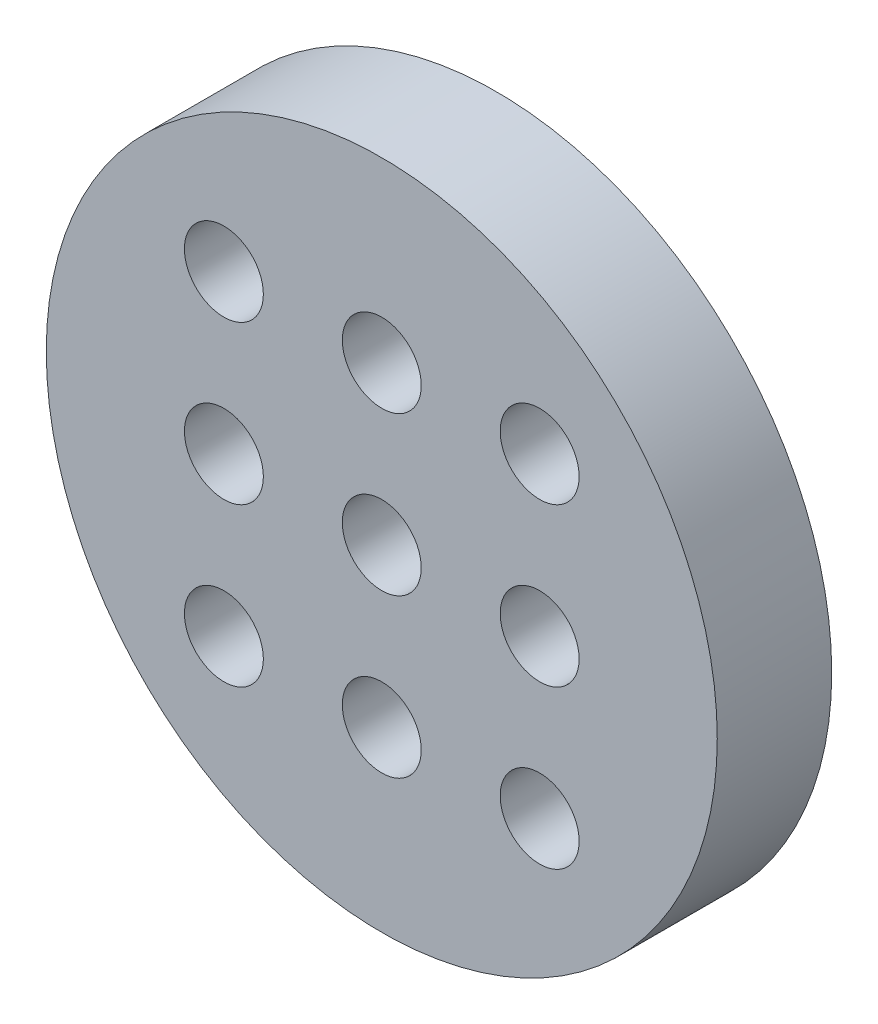
ISO-10303-21;
HEADER;
FILE_DESCRIPTION(('STEP AP214'),'2;1');
FILE_NAME('part.step','',(''),(''),'','','');
FILE_SCHEMA(('AUTOMOTIVE_DESIGN { 1 0 10303 214 1 1 1 1 }'));
ENDSEC;
DATA;
#1=APPLICATION_CONTEXT('core data for automotive mechanical design processes');
#2=APPLICATION_PROTOCOL_DEFINITION('international standard','automotive_design',2000,#1);
#3=PRODUCT_CONTEXT('',#1,'mechanical');
#4=PRODUCT('Part','Part','',(#3));
#5=PRODUCT_RELATED_PRODUCT_CATEGORY('part','',(#4));
#6=PRODUCT_DEFINITION_FORMATION('','',#4);
#7=PRODUCT_DEFINITION_CONTEXT('part definition',#1,'design');
#8=PRODUCT_DEFINITION('design','',#6,#7);
#9=PRODUCT_DEFINITION_SHAPE('','',#8);
#10=(LENGTH_UNIT() NAMED_UNIT(*) SI_UNIT(.MILLI.,.METRE.));
#11=(NAMED_UNIT(*) PLANE_ANGLE_UNIT() SI_UNIT($,.RADIAN.));
#12=(NAMED_UNIT(*) SI_UNIT($,.STERADIAN.) SOLID_ANGLE_UNIT());
#13=UNCERTAINTY_MEASURE_WITH_UNIT(LENGTH_MEASURE(1.E-05),#10,'distance_accuracy_value','');
#14=(GEOMETRIC_REPRESENTATION_CONTEXT(3) GLOBAL_UNCERTAINTY_ASSIGNED_CONTEXT((#13)) GLOBAL_UNIT_ASSIGNED_CONTEXT((#10,
#11,#12)) REPRESENTATION_CONTEXT('',''));
#15=CARTESIAN_POINT('',(0.,0.,0.));
#16=DIRECTION('',(0.,0.,1.));
#17=DIRECTION('',(1.,0.,0.));
#18=AXIS2_PLACEMENT_3D('',#15,#16,#17);
#19=CARTESIAN_POINT('',(0.,0.,-2.9));
#20=DIRECTION('',(0.,0.,-1.));
#21=DIRECTION('',(-1.,0.,0.));
#22=AXIS2_PLACEMENT_3D('',#19,#20,#21);
#23=PLANE('',#22);
#24=CARTESIAN_POINT('',(0.,0.,-2.9));
#25=DIRECTION('',(0.,0.,1.));
#26=DIRECTION('',(1.,0.,0.));
#27=AXIS2_PLACEMENT_3D('',#24,#25,#26);
#28=CIRCLE('',#27,17.);
#29=CARTESIAN_POINT('',(17.,0.,-2.9));
#30=VERTEX_POINT('',#29);
#31=EDGE_CURVE('E52',#30,#30,#28,.T.);
#32=ORIENTED_EDGE('',*,*,#31,.F.);
#33=EDGE_LOOP('',(#32));
#34=FACE_BOUND('',#33,.T.);
#35=CARTESIAN_POINT('',(-8.,8.,-2.9));
#36=DIRECTION('',(0.,0.,1.));
#37=DIRECTION('',(1.,0.,0.));
#38=AXIS2_PLACEMENT_3D('',#35,#36,#37);
#39=CIRCLE('',#38,2.);
#40=CARTESIAN_POINT('',(-6.,8.,-2.9));
#41=VERTEX_POINT('',#40);
#42=EDGE_CURVE('E55',#41,#41,#39,.T.);
#43=ORIENTED_EDGE('',*,*,#42,.T.);
#44=EDGE_LOOP('',(#43));
#45=FACE_BOUND('',#44,.T.);
#46=CARTESIAN_POINT('',(8.,8.,-2.9));
#47=DIRECTION('',(0.,0.,1.));
#48=DIRECTION('',(1.,0.,0.));
#49=AXIS2_PLACEMENT_3D('',#46,#47,#48);
#50=CIRCLE('',#49,2.);
#51=CARTESIAN_POINT('',(10.,8.,-2.9));
#52=VERTEX_POINT('',#51);
#53=EDGE_CURVE('E58',#52,#52,#50,.T.);
#54=ORIENTED_EDGE('',*,*,#53,.T.);
#55=EDGE_LOOP('',(#54));
#56=FACE_BOUND('',#55,.T.);
#57=CARTESIAN_POINT('',(8.,-8.,-2.9));
#58=DIRECTION('',(0.,0.,1.));
#59=DIRECTION('',(1.,0.,0.));
#60=AXIS2_PLACEMENT_3D('',#57,#58,#59);
#61=CIRCLE('',#60,2.);
#62=CARTESIAN_POINT('',(10.,-8.,-2.9));
#63=VERTEX_POINT('',#62);
#64=EDGE_CURVE('E61',#63,#63,#61,.T.);
#65=ORIENTED_EDGE('',*,*,#64,.T.);
#66=EDGE_LOOP('',(#65));
#67=FACE_BOUND('',#66,.T.);
#68=CARTESIAN_POINT('',(-8.,-8.,-2.9));
#69=DIRECTION('',(0.,0.,1.));
#70=DIRECTION('',(1.,0.,0.));
#71=AXIS2_PLACEMENT_3D('',#68,#69,#70);
#72=CIRCLE('',#71,2.);
#73=CARTESIAN_POINT('',(-6.,-8.,-2.9));
#74=VERTEX_POINT('',#73);
#75=EDGE_CURVE('E64',#74,#74,#72,.T.);
#76=ORIENTED_EDGE('',*,*,#75,.T.);
#77=EDGE_LOOP('',(#76));
#78=FACE_BOUND('',#77,.T.);
#79=CARTESIAN_POINT('',(0.,8.,-2.9));
#80=DIRECTION('',(0.,0.,1.));
#81=DIRECTION('',(1.,0.,0.));
#82=AXIS2_PLACEMENT_3D('',#79,#80,#81);
#83=CIRCLE('',#82,2.);
#84=CARTESIAN_POINT('',(2.,8.,-2.9));
#85=VERTEX_POINT('',#84);
#86=EDGE_CURVE('E67',#85,#85,#83,.T.);
#87=ORIENTED_EDGE('',*,*,#86,.T.);
#88=EDGE_LOOP('',(#87));
#89=FACE_BOUND('',#88,.T.);
#90=CARTESIAN_POINT('',(8.,0.,-2.9));
#91=DIRECTION('',(0.,0.,1.));
#92=DIRECTION('',(1.,0.,0.));
#93=AXIS2_PLACEMENT_3D('',#90,#91,#92);
#94=CIRCLE('',#93,2.);
#95=CARTESIAN_POINT('',(10.,0.,-2.9));
#96=VERTEX_POINT('',#95);
#97=EDGE_CURVE('E70',#96,#96,#94,.T.);
#98=ORIENTED_EDGE('',*,*,#97,.T.);
#99=EDGE_LOOP('',(#98));
#100=FACE_BOUND('',#99,.T.);
#101=CARTESIAN_POINT('',(0.,-8.,-2.9));
#102=DIRECTION('',(0.,0.,1.));
#103=DIRECTION('',(1.,0.,0.));
#104=AXIS2_PLACEMENT_3D('',#101,#102,#103);
#105=CIRCLE('',#104,2.);
#106=CARTESIAN_POINT('',(2.,-8.,-2.9));
#107=VERTEX_POINT('',#106);
#108=EDGE_CURVE('E73',#107,#107,#105,.T.);
#109=ORIENTED_EDGE('',*,*,#108,.T.);
#110=EDGE_LOOP('',(#109));
#111=FACE_BOUND('',#110,.T.);
#112=CARTESIAN_POINT('',(-8.,0.,-2.9));
#113=DIRECTION('',(0.,0.,1.));
#114=DIRECTION('',(1.,0.,0.));
#115=AXIS2_PLACEMENT_3D('',#112,#113,#114);
#116=CIRCLE('',#115,2.);
#117=CARTESIAN_POINT('',(-6.,0.,-2.9));
#118=VERTEX_POINT('',#117);
#119=EDGE_CURVE('E75',#118,#118,#116,.T.);
#120=ORIENTED_EDGE('',*,*,#119,.T.);
#121=EDGE_LOOP('',(#120));
#122=FACE_BOUND('',#121,.T.);
#123=CARTESIAN_POINT('',(0.,0.,-2.9));
#124=DIRECTION('',(0.,0.,1.));
#125=DIRECTION('',(1.,0.,0.));
#126=AXIS2_PLACEMENT_3D('',#123,#124,#125);
#127=CIRCLE('',#126,2.);
#128=CARTESIAN_POINT('',(2.,0.,-2.9));
#129=VERTEX_POINT('',#128);
#130=EDGE_CURVE('E17',#129,#129,#127,.T.);
#131=ORIENTED_EDGE('',*,*,#130,.T.);
#132=EDGE_LOOP('',(#131));
#133=FACE_BOUND('',#132,.T.);
#134=ADVANCED_FACE('F14',(#34,#45,#56,#67,#78,#89,#100,#111,#122,#133),#23,.T.);
#135=CARTESIAN_POINT('',(0.,0.,20.2046487242348));
#136=DIRECTION('',(0.,0.,1.));
#137=DIRECTION('',(1.,0.,0.));
#138=AXIS2_PLACEMENT_3D('',#135,#136,#137);
#139=CYLINDRICAL_SURFACE('',#138,2.);
#140=CARTESIAN_POINT('',(0.,0.,2.9));
#141=DIRECTION('',(0.,0.,1.));
#142=DIRECTION('',(1.,0.,0.));
#143=AXIS2_PLACEMENT_3D('',#140,#141,#142);
#144=CIRCLE('',#143,2.);
#145=CARTESIAN_POINT('',(2.,0.,2.9));
#146=VERTEX_POINT('',#145);
#147=EDGE_CURVE('E49',#146,#146,#144,.T.);
#148=ORIENTED_EDGE('',*,*,#147,.T.);
#149=EDGE_LOOP('',(#148));
#150=FACE_BOUND('',#149,.T.);
#151=ORIENTED_EDGE('',*,*,#130,.F.);
#152=EDGE_LOOP('',(#151));
#153=FACE_BOUND('',#152,.T.);
#154=ADVANCED_FACE('F83',(#150,#153),#139,.F.);
#155=CARTESIAN_POINT('',(-8.,0.,20.2046487242348));
#156=DIRECTION('',(0.,0.,1.));
#157=DIRECTION('',(1.,0.,0.));
#158=AXIS2_PLACEMENT_3D('',#155,#156,#157);
#159=CYLINDRICAL_SURFACE('',#158,2.);
#160=CARTESIAN_POINT('',(-8.,0.,2.9));
#161=DIRECTION('',(0.,0.,1.));
#162=DIRECTION('',(1.,0.,0.));
#163=AXIS2_PLACEMENT_3D('',#160,#161,#162);
#164=CIRCLE('',#163,2.);
#165=CARTESIAN_POINT('',(-6.,0.,2.9));
#166=VERTEX_POINT('',#165);
#167=EDGE_CURVE('E46',#166,#166,#164,.T.);
#168=ORIENTED_EDGE('',*,*,#167,.T.);
#169=EDGE_LOOP('',(#168));
#170=FACE_BOUND('',#169,.T.);
#171=ORIENTED_EDGE('',*,*,#119,.F.);
#172=EDGE_LOOP('',(#171));
#173=FACE_BOUND('',#172,.T.);
#174=ADVANCED_FACE('F85',(#170,#173),#159,.F.);
#175=CARTESIAN_POINT('',(0.,-8.,20.2046487242348));
#176=DIRECTION('',(0.,0.,1.));
#177=DIRECTION('',(1.,0.,0.));
#178=AXIS2_PLACEMENT_3D('',#175,#176,#177);
#179=CYLINDRICAL_SURFACE('',#178,2.);
#180=CARTESIAN_POINT('',(0.,-8.,2.9));
#181=DIRECTION('',(0.,0.,1.));
#182=DIRECTION('',(1.,0.,0.));
#183=AXIS2_PLACEMENT_3D('',#180,#181,#182);
#184=CIRCLE('',#183,2.);
#185=CARTESIAN_POINT('',(2.,-8.,2.9));
#186=VERTEX_POINT('',#185);
#187=EDGE_CURVE('E43',#186,#186,#184,.T.);
#188=ORIENTED_EDGE('',*,*,#187,.T.);
#189=EDGE_LOOP('',(#188));
#190=FACE_BOUND('',#189,.T.);
#191=ORIENTED_EDGE('',*,*,#108,.F.);
#192=EDGE_LOOP('',(#191));
#193=FACE_BOUND('',#192,.T.);
#194=ADVANCED_FACE('F92',(#190,#193),#179,.F.);
#195=CARTESIAN_POINT('',(8.,0.,20.2046487242348));
#196=DIRECTION('',(0.,0.,1.));
#197=DIRECTION('',(1.,0.,0.));
#198=AXIS2_PLACEMENT_3D('',#195,#196,#197);
#199=CYLINDRICAL_SURFACE('',#198,2.);
#200=CARTESIAN_POINT('',(8.,0.,2.9));
#201=DIRECTION('',(0.,0.,1.));
#202=DIRECTION('',(1.,0.,0.));
#203=AXIS2_PLACEMENT_3D('',#200,#201,#202);
#204=CIRCLE('',#203,2.);
#205=CARTESIAN_POINT('',(10.,0.,2.9));
#206=VERTEX_POINT('',#205);
#207=EDGE_CURVE('E40',#206,#206,#204,.T.);
#208=ORIENTED_EDGE('',*,*,#207,.T.);
#209=EDGE_LOOP('',(#208));
#210=FACE_BOUND('',#209,.T.);
#211=ORIENTED_EDGE('',*,*,#97,.F.);
#212=EDGE_LOOP('',(#211));
#213=FACE_BOUND('',#212,.T.);
#214=ADVANCED_FACE('F127',(#210,#213),#199,.F.);
#215=CARTESIAN_POINT('',(0.,8.,20.2046487242348));
#216=DIRECTION('',(0.,0.,1.));
#217=DIRECTION('',(1.,0.,0.));
#218=AXIS2_PLACEMENT_3D('',#215,#216,#217);
#219=CYLINDRICAL_SURFACE('',#218,2.);
#220=CARTESIAN_POINT('',(0.,8.,2.9));
#221=DIRECTION('',(0.,0.,1.));
#222=DIRECTION('',(1.,0.,0.));
#223=AXIS2_PLACEMENT_3D('',#220,#221,#222);
#224=CIRCLE('',#223,2.);
#225=CARTESIAN_POINT('',(2.,8.,2.9));
#226=VERTEX_POINT('',#225);
#227=EDGE_CURVE('E37',#226,#226,#224,.T.);
#228=ORIENTED_EDGE('',*,*,#227,.T.);
#229=EDGE_LOOP('',(#228));
#230=FACE_BOUND('',#229,.T.);
#231=ORIENTED_EDGE('',*,*,#86,.F.);
#232=EDGE_LOOP('',(#231));
#233=FACE_BOUND('',#232,.T.);
#234=ADVANCED_FACE('F123',(#230,#233),#219,.F.);
#235=CARTESIAN_POINT('',(-8.,-8.,10.9521280958841));
#236=DIRECTION('',(0.,0.,1.));
#237=DIRECTION('',(1.,0.,0.));
#238=AXIS2_PLACEMENT_3D('',#235,#236,#237);
#239=CYLINDRICAL_SURFACE('',#238,2.);
#240=CARTESIAN_POINT('',(-8.,-8.,2.9));
#241=DIRECTION('',(0.,0.,1.));
#242=DIRECTION('',(1.,0.,0.));
#243=AXIS2_PLACEMENT_3D('',#240,#241,#242);
#244=CIRCLE('',#243,2.);
#245=CARTESIAN_POINT('',(-6.,-8.,2.9));
#246=VERTEX_POINT('',#245);
#247=EDGE_CURVE('E34',#246,#246,#244,.T.);
#248=ORIENTED_EDGE('',*,*,#247,.T.);
#249=EDGE_LOOP('',(#248));
#250=FACE_BOUND('',#249,.T.);
#251=ORIENTED_EDGE('',*,*,#75,.F.);
#252=EDGE_LOOP('',(#251));
#253=FACE_BOUND('',#252,.T.);
#254=ADVANCED_FACE('F119',(#250,#253),#239,.F.);
#255=CARTESIAN_POINT('',(8.,-8.,10.9521280958841));
#256=DIRECTION('',(0.,0.,1.));
#257=DIRECTION('',(1.,0.,0.));
#258=AXIS2_PLACEMENT_3D('',#255,#256,#257);
#259=CYLINDRICAL_SURFACE('',#258,2.);
#260=CARTESIAN_POINT('',(8.,-8.,2.9));
#261=DIRECTION('',(0.,0.,1.));
#262=DIRECTION('',(1.,0.,0.));
#263=AXIS2_PLACEMENT_3D('',#260,#261,#262);
#264=CIRCLE('',#263,2.);
#265=CARTESIAN_POINT('',(10.,-8.,2.9));
#266=VERTEX_POINT('',#265);
#267=EDGE_CURVE('E31',#266,#266,#264,.T.);
#268=ORIENTED_EDGE('',*,*,#267,.T.);
#269=EDGE_LOOP('',(#268));
#270=FACE_BOUND('',#269,.T.);
#271=ORIENTED_EDGE('',*,*,#64,.F.);
#272=EDGE_LOOP('',(#271));
#273=FACE_BOUND('',#272,.T.);
#274=ADVANCED_FACE('F115',(#270,#273),#259,.F.);
#275=CARTESIAN_POINT('',(8.,8.,10.9521280958841));
#276=DIRECTION('',(0.,0.,1.));
#277=DIRECTION('',(1.,0.,0.));
#278=AXIS2_PLACEMENT_3D('',#275,#276,#277);
#279=CYLINDRICAL_SURFACE('',#278,2.);
#280=CARTESIAN_POINT('',(8.,8.,2.9));
#281=DIRECTION('',(0.,0.,1.));
#282=DIRECTION('',(1.,0.,0.));
#283=AXIS2_PLACEMENT_3D('',#280,#281,#282);
#284=CIRCLE('',#283,2.);
#285=CARTESIAN_POINT('',(10.,8.,2.9));
#286=VERTEX_POINT('',#285);
#287=EDGE_CURVE('E26',#286,#286,#284,.T.);
#288=ORIENTED_EDGE('',*,*,#287,.T.);
#289=EDGE_LOOP('',(#288));
#290=FACE_BOUND('',#289,.T.);
#291=ORIENTED_EDGE('',*,*,#53,.F.);
#292=EDGE_LOOP('',(#291));
#293=FACE_BOUND('',#292,.T.);
#294=ADVANCED_FACE('F111',(#290,#293),#279,.F.);
#295=CARTESIAN_POINT('',(-8.,8.,10.9521280958841));
#296=DIRECTION('',(0.,0.,1.));
#297=DIRECTION('',(1.,0.,0.));
#298=AXIS2_PLACEMENT_3D('',#295,#296,#297);
#299=CYLINDRICAL_SURFACE('',#298,2.);
#300=CARTESIAN_POINT('',(-8.,8.,2.9));
#301=DIRECTION('',(0.,0.,1.));
#302=DIRECTION('',(1.,0.,0.));
#303=AXIS2_PLACEMENT_3D('',#300,#301,#302);
#304=CIRCLE('',#303,2.);
#305=CARTESIAN_POINT('',(-6.,8.,2.9));
#306=VERTEX_POINT('',#305);
#307=EDGE_CURVE('E21',#306,#306,#304,.T.);
#308=ORIENTED_EDGE('',*,*,#307,.T.);
#309=EDGE_LOOP('',(#308));
#310=FACE_BOUND('',#309,.T.);
#311=ORIENTED_EDGE('',*,*,#42,.F.);
#312=EDGE_LOOP('',(#311));
#313=FACE_BOUND('',#312,.T.);
#314=ADVANCED_FACE('F104',(#310,#313),#299,.F.);
#315=CARTESIAN_POINT('',(0.,0.,2.9));
#316=DIRECTION('',(0.,0.,1.));
#317=DIRECTION('',(1.,0.,0.));
#318=AXIS2_PLACEMENT_3D('',#315,#316,#317);
#319=CYLINDRICAL_SURFACE('',#318,17.);
#320=ORIENTED_EDGE('',*,*,#31,.T.);
#321=EDGE_LOOP('',(#320));
#322=FACE_BOUND('',#321,.T.);
#323=CARTESIAN_POINT('',(0.,0.,2.9));
#324=DIRECTION('',(0.,0.,1.));
#325=DIRECTION('',(1.,0.,0.));
#326=AXIS2_PLACEMENT_3D('',#323,#324,#325);
#327=CIRCLE('',#326,17.);
#328=CARTESIAN_POINT('',(17.,0.,2.9));
#329=VERTEX_POINT('',#328);
#330=EDGE_CURVE('E10',#329,#329,#327,.F.);
#331=ORIENTED_EDGE('',*,*,#330,.T.);
#332=EDGE_LOOP('',(#331));
#333=FACE_BOUND('',#332,.T.);
#334=ADVANCED_FACE('F98',(#322,#333),#319,.T.);
#335=CARTESIAN_POINT('',(0.,0.,2.9));
#336=DIRECTION('',(0.,0.,-1.));
#337=DIRECTION('',(-1.,0.,0.));
#338=AXIS2_PLACEMENT_3D('',#335,#336,#337);
#339=PLANE('',#338);
#340=ORIENTED_EDGE('',*,*,#330,.F.);
#341=EDGE_LOOP('',(#340));
#342=FACE_BOUND('',#341,.T.);
#343=ORIENTED_EDGE('',*,*,#307,.F.);
#344=EDGE_LOOP('',(#343));
#345=FACE_BOUND('',#344,.T.);
#346=ORIENTED_EDGE('',*,*,#287,.F.);
#347=EDGE_LOOP('',(#346));
#348=FACE_BOUND('',#347,.T.);
#349=ORIENTED_EDGE('',*,*,#267,.F.);
#350=EDGE_LOOP('',(#349));
#351=FACE_BOUND('',#350,.T.);
#352=ORIENTED_EDGE('',*,*,#247,.F.);
#353=EDGE_LOOP('',(#352));
#354=FACE_BOUND('',#353,.T.);
#355=ORIENTED_EDGE('',*,*,#227,.F.);
#356=EDGE_LOOP('',(#355));
#357=FACE_BOUND('',#356,.T.);
#358=ORIENTED_EDGE('',*,*,#207,.F.);
#359=EDGE_LOOP('',(#358));
#360=FACE_BOUND('',#359,.T.);
#361=ORIENTED_EDGE('',*,*,#187,.F.);
#362=EDGE_LOOP('',(#361));
#363=FACE_BOUND('',#362,.T.);
#364=ORIENTED_EDGE('',*,*,#167,.F.);
#365=EDGE_LOOP('',(#364));
#366=FACE_BOUND('',#365,.T.);
#367=ORIENTED_EDGE('',*,*,#147,.F.);
#368=EDGE_LOOP('',(#367));
#369=FACE_BOUND('',#368,.T.);
#370=ADVANCED_FACE('F96',(#342,#345,#348,#351,#354,#357,#360,#363,#366,#369),#339,.F.);
#371=CLOSED_SHELL('',(#134,#154,#174,#194,#214,#234,#254,#274,#294,#314,#334,#370));
#372=MANIFOLD_SOLID_BREP('B1',#371);
#373=ADVANCED_BREP_SHAPE_REPRESENTATION('',(#18,#372),#14);
#374=SHAPE_DEFINITION_REPRESENTATION(#9,#373);
ENDSEC;
END-ISO-10303-21;
